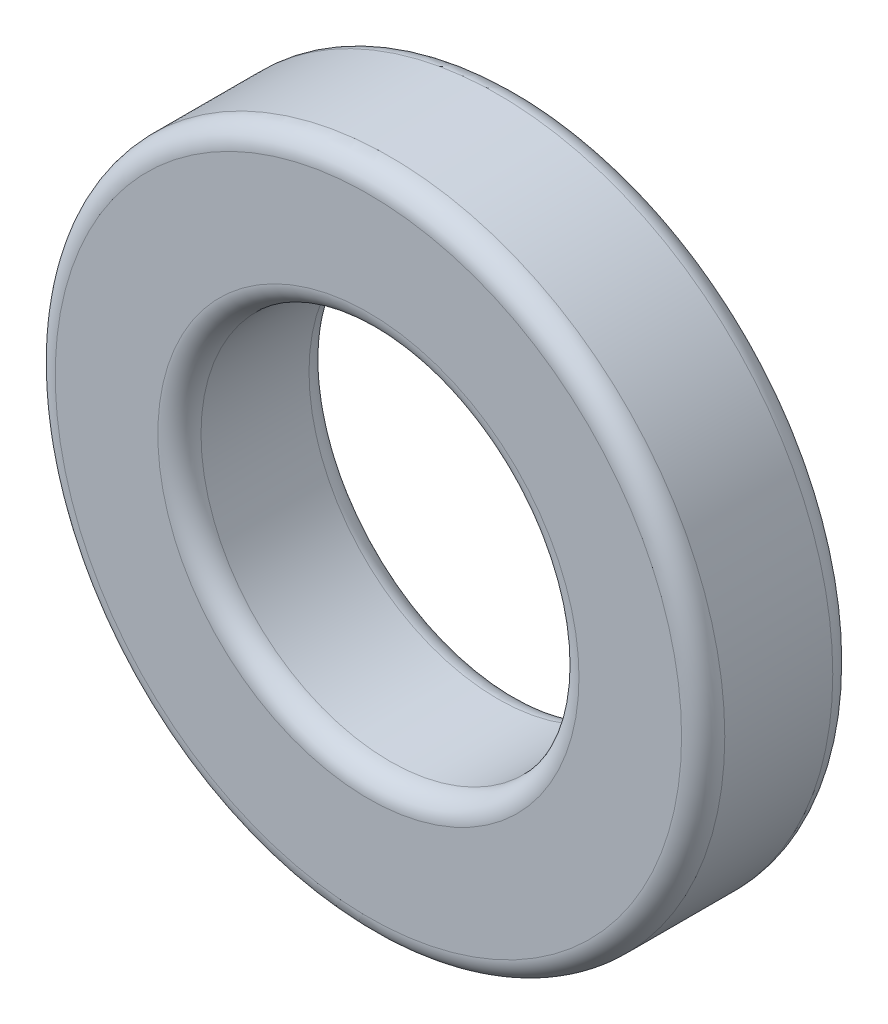
ISO-10303-21;
HEADER;
FILE_DESCRIPTION(('STEP AP214'),'2;1');
FILE_NAME('part.step','',(''),(''),'','','');
FILE_SCHEMA(('AUTOMOTIVE_DESIGN { 1 0 10303 214 1 1 1 1 }'));
ENDSEC;
DATA;
#1=APPLICATION_CONTEXT('core data for automotive mechanical design processes');
#2=APPLICATION_PROTOCOL_DEFINITION('international standard','automotive_design',2000,#1);
#3=PRODUCT_CONTEXT('',#1,'mechanical');
#4=PRODUCT('Part','Part','',(#3));
#5=PRODUCT_RELATED_PRODUCT_CATEGORY('part','',(#4));
#6=PRODUCT_DEFINITION_FORMATION('','',#4);
#7=PRODUCT_DEFINITION_CONTEXT('part definition',#1,'design');
#8=PRODUCT_DEFINITION('design','',#6,#7);
#9=PRODUCT_DEFINITION_SHAPE('','',#8);
#10=(LENGTH_UNIT() NAMED_UNIT(*) SI_UNIT(.MILLI.,.METRE.));
#11=(NAMED_UNIT(*) PLANE_ANGLE_UNIT() SI_UNIT($,.RADIAN.));
#12=(NAMED_UNIT(*) SI_UNIT($,.STERADIAN.) SOLID_ANGLE_UNIT());
#13=UNCERTAINTY_MEASURE_WITH_UNIT(LENGTH_MEASURE(1.E-05),#10,'distance_accuracy_value','');
#14=(GEOMETRIC_REPRESENTATION_CONTEXT(3) GLOBAL_UNCERTAINTY_ASSIGNED_CONTEXT((#13)) GLOBAL_UNIT_ASSIGNED_CONTEXT((#10,
#11,#12)) REPRESENTATION_CONTEXT('',''));
#15=CARTESIAN_POINT('',(0.,0.,0.));
#16=DIRECTION('',(0.,0.,1.));
#17=DIRECTION('',(1.,0.,0.));
#18=AXIS2_PLACEMENT_3D('',#15,#16,#17);
#19=CARTESIAN_POINT('',(0.,0.,14.));
#20=DIRECTION('',(0.,0.,1.));
#21=DIRECTION('',(1.,0.,0.));
#22=AXIS2_PLACEMENT_3D('',#19,#20,#21);
#23=PLANE('',#22);
#24=CARTESIAN_POINT('',(0.,0.,14.));
#25=DIRECTION('',(0.,0.,1.));
#26=DIRECTION('',(1.,0.,0.));
#27=AXIS2_PLACEMENT_3D('',#24,#25,#26);
#28=CIRCLE('',#27,19.5);
#29=CARTESIAN_POINT('',(19.5,0.,14.));
#30=VERTEX_POINT('',#29);
#31=EDGE_CURVE('E10',#30,#30,#28,.F.);
#32=ORIENTED_EDGE('',*,*,#31,.T.);
#33=EDGE_LOOP('',(#32));
#34=FACE_BOUND('',#33,.T.);
#35=CARTESIAN_POINT('',(0.,0.,14.));
#36=DIRECTION('',(0.,0.,1.));
#37=DIRECTION('',(1.,0.,0.));
#38=AXIS2_PLACEMENT_3D('',#35,#36,#37);
#39=CIRCLE('',#38,29.);
#40=CARTESIAN_POINT('',(29.,0.,14.));
#41=VERTEX_POINT('',#40);
#42=EDGE_CURVE('E45',#41,#41,#39,.T.);
#43=ORIENTED_EDGE('',*,*,#42,.T.);
#44=EDGE_LOOP('',(#43));
#45=FACE_BOUND('',#44,.T.);
#46=ADVANCED_FACE('F37',(#34,#45),#23,.T.);
#47=CARTESIAN_POINT('',(0.,0.,0.));
#48=DIRECTION('',(0.,0.,1.));
#49=DIRECTION('',(1.,0.,0.));
#50=AXIS2_PLACEMENT_3D('',#47,#48,#49);
#51=PLANE('',#50);
#52=CARTESIAN_POINT('',(0.,0.,0.));
#53=DIRECTION('',(0.,0.,1.));
#54=DIRECTION('',(1.,0.,0.));
#55=AXIS2_PLACEMENT_3D('',#52,#53,#54);
#56=CIRCLE('',#55,19.5);
#57=CARTESIAN_POINT('',(19.5,0.,0.));
#58=VERTEX_POINT('',#57);
#59=EDGE_CURVE('E69',#58,#58,#56,.T.);
#60=ORIENTED_EDGE('',*,*,#59,.T.);
#61=EDGE_LOOP('',(#60));
#62=FACE_BOUND('',#61,.T.);
#63=CARTESIAN_POINT('',(0.,0.,0.));
#64=DIRECTION('',(0.,0.,1.));
#65=DIRECTION('',(1.,0.,0.));
#66=AXIS2_PLACEMENT_3D('',#63,#64,#65);
#67=CIRCLE('',#66,29.);
#68=CARTESIAN_POINT('',(29.,0.,0.));
#69=VERTEX_POINT('',#68);
#70=EDGE_CURVE('E73',#69,#69,#67,.F.);
#71=ORIENTED_EDGE('',*,*,#70,.T.);
#72=EDGE_LOOP('',(#71));
#73=FACE_BOUND('',#72,.T.);
#74=ADVANCED_FACE('F78',(#62,#73),#51,.F.);
#75=CARTESIAN_POINT('',(0.,0.,14.));
#76=DIRECTION('',(0.,0.,-1.));
#77=DIRECTION('',(-1.,0.,0.));
#78=AXIS2_PLACEMENT_3D('',#75,#76,#77);
#79=CYLINDRICAL_SURFACE('',#78,31.);
#80=CARTESIAN_POINT('',(0.,0.,2.));
#81=DIRECTION('',(0.,0.,1.));
#82=DIRECTION('',(1.,0.,0.));
#83=AXIS2_PLACEMENT_3D('',#80,#81,#82);
#84=CIRCLE('',#83,31.);
#85=CARTESIAN_POINT('',(31.,0.,2.));
#86=VERTEX_POINT('',#85);
#87=EDGE_CURVE('E50',#86,#86,#84,.T.);
#88=ORIENTED_EDGE('',*,*,#87,.T.);
#89=EDGE_LOOP('',(#88));
#90=FACE_BOUND('',#89,.T.);
#91=CARTESIAN_POINT('',(0.,0.,12.));
#92=DIRECTION('',(0.,0.,1.));
#93=DIRECTION('',(1.,0.,0.));
#94=AXIS2_PLACEMENT_3D('',#91,#92,#93);
#95=CIRCLE('',#94,31.);
#96=CARTESIAN_POINT('',(31.,0.,12.));
#97=VERTEX_POINT('',#96);
#98=EDGE_CURVE('E55',#97,#97,#95,.F.);
#99=ORIENTED_EDGE('',*,*,#98,.T.);
#100=EDGE_LOOP('',(#99));
#101=FACE_BOUND('',#100,.T.);
#102=ADVANCED_FACE('F88',(#90,#101),#79,.T.);
#103=CARTESIAN_POINT('',(0.,0.,14.));
#104=DIRECTION('',(0.,0.,-1.));
#105=DIRECTION('',(-1.,0.,0.));
#106=AXIS2_PLACEMENT_3D('',#103,#104,#105);
#107=CYLINDRICAL_SURFACE('',#106,17.5);
#108=CARTESIAN_POINT('',(0.,0.,2.));
#109=DIRECTION('',(0.,0.,1.));
#110=DIRECTION('',(1.,0.,0.));
#111=AXIS2_PLACEMENT_3D('',#108,#109,#110);
#112=CIRCLE('',#111,17.5);
#113=CARTESIAN_POINT('',(17.5,0.,2.));
#114=VERTEX_POINT('',#113);
#115=EDGE_CURVE('E61',#114,#114,#112,.F.);
#116=ORIENTED_EDGE('',*,*,#115,.T.);
#117=EDGE_LOOP('',(#116));
#118=FACE_BOUND('',#117,.T.);
#119=CARTESIAN_POINT('',(0.,0.,12.));
#120=DIRECTION('',(0.,0.,1.));
#121=DIRECTION('',(1.,0.,0.));
#122=AXIS2_PLACEMENT_3D('',#119,#120,#121);
#123=CIRCLE('',#122,17.5);
#124=CARTESIAN_POINT('',(17.5,0.,12.));
#125=VERTEX_POINT('',#124);
#126=EDGE_CURVE('E65',#125,#125,#123,.T.);
#127=ORIENTED_EDGE('',*,*,#126,.T.);
#128=EDGE_LOOP('',(#127));
#129=FACE_BOUND('',#128,.T.);
#130=ADVANCED_FACE('F91',(#118,#129),#107,.F.);
#131=CARTESIAN_POINT('',(0.,0.,2.));
#132=DIRECTION('',(0.,0.,1.));
#133=DIRECTION('',(1.,0.,0.));
#134=AXIS2_PLACEMENT_3D('',#131,#132,#133);
#135=TOROIDAL_SURFACE('',#134,19.5,2.);
#136=ORIENTED_EDGE('',*,*,#115,.F.);
#137=EDGE_LOOP('',(#136));
#138=FACE_BOUND('',#137,.T.);
#139=ORIENTED_EDGE('',*,*,#59,.F.);
#140=EDGE_LOOP('',(#139));
#141=FACE_BOUND('',#140,.T.);
#142=ADVANCED_FACE('F84',(#138,#141),#135,.T.);
#143=CARTESIAN_POINT('',(0.,0.,2.));
#144=DIRECTION('',(0.,0.,1.));
#145=DIRECTION('',(1.,0.,0.));
#146=AXIS2_PLACEMENT_3D('',#143,#144,#145);
#147=TOROIDAL_SURFACE('',#146,29.,2.);
#148=ORIENTED_EDGE('',*,*,#70,.F.);
#149=EDGE_LOOP('',(#148));
#150=FACE_BOUND('',#149,.T.);
#151=ORIENTED_EDGE('',*,*,#87,.F.);
#152=EDGE_LOOP('',(#151));
#153=FACE_BOUND('',#152,.T.);
#154=ADVANCED_FACE('F80',(#150,#153),#147,.T.);
#155=CARTESIAN_POINT('',(0.,0.,12.));
#156=DIRECTION('',(0.,0.,1.));
#157=DIRECTION('',(1.,0.,0.));
#158=AXIS2_PLACEMENT_3D('',#155,#156,#157);
#159=TOROIDAL_SURFACE('',#158,19.5,2.);
#160=ORIENTED_EDGE('',*,*,#31,.F.);
#161=EDGE_LOOP('',(#160));
#162=FACE_BOUND('',#161,.T.);
#163=ORIENTED_EDGE('',*,*,#126,.F.);
#164=EDGE_LOOP('',(#163));
#165=FACE_BOUND('',#164,.T.);
#166=ADVANCED_FACE('F83',(#162,#165),#159,.T.);
#167=CARTESIAN_POINT('',(0.,0.,12.));
#168=DIRECTION('',(0.,0.,1.));
#169=DIRECTION('',(1.,0.,0.));
#170=AXIS2_PLACEMENT_3D('',#167,#168,#169);
#171=TOROIDAL_SURFACE('',#170,29.,2.);
#172=ORIENTED_EDGE('',*,*,#98,.F.);
#173=EDGE_LOOP('',(#172));
#174=FACE_BOUND('',#173,.T.);
#175=ORIENTED_EDGE('',*,*,#42,.F.);
#176=EDGE_LOOP('',(#175));
#177=FACE_BOUND('',#176,.T.);
#178=ADVANCED_FACE('F39',(#174,#177),#171,.T.);
#179=CLOSED_SHELL('',(#46,#74,#102,#130,#142,#154,#166,#178));
#180=MANIFOLD_SOLID_BREP('B2',#179);
#181=ADVANCED_BREP_SHAPE_REPRESENTATION('',(#18,#180),#14);
#182=SHAPE_DEFINITION_REPRESENTATION(#9,#181);
ENDSEC;
END-ISO-10303-21;
